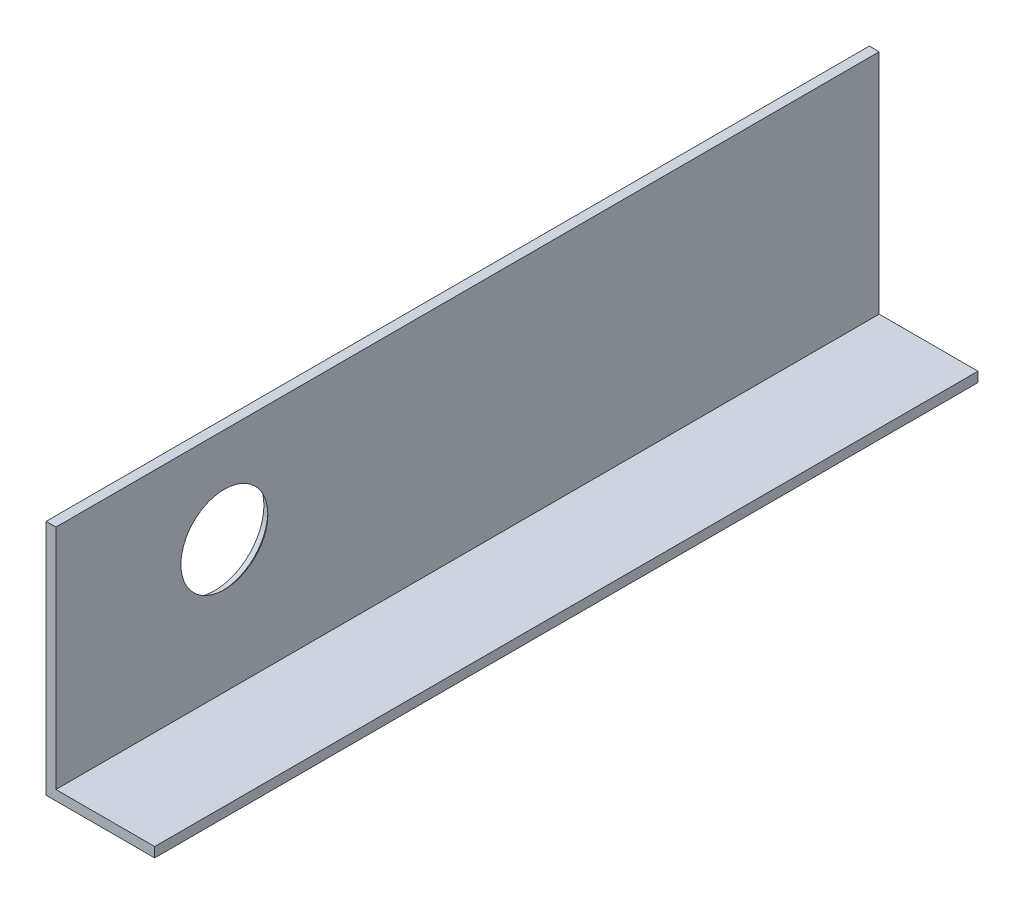
ISO-10303-21;
HEADER;
FILE_DESCRIPTION(('STEP AP214'),'2;1');
FILE_NAME('part.step','',(''),(''),'','','');
FILE_SCHEMA(('AUTOMOTIVE_DESIGN { 1 0 10303 214 1 1 1 1 }'));
ENDSEC;
DATA;
#1=APPLICATION_CONTEXT('core data for automotive mechanical design processes');
#2=APPLICATION_PROTOCOL_DEFINITION('international standard','automotive_design',2000,#1);
#3=PRODUCT_CONTEXT('',#1,'mechanical');
#4=PRODUCT('Part','Part','',(#3));
#5=PRODUCT_RELATED_PRODUCT_CATEGORY('part','',(#4));
#6=PRODUCT_DEFINITION_FORMATION('','',#4);
#7=PRODUCT_DEFINITION_CONTEXT('part definition',#1,'design');
#8=PRODUCT_DEFINITION('design','',#6,#7);
#9=PRODUCT_DEFINITION_SHAPE('','',#8);
#10=(LENGTH_UNIT() NAMED_UNIT(*) SI_UNIT(.MILLI.,.METRE.));
#11=(NAMED_UNIT(*) PLANE_ANGLE_UNIT() SI_UNIT($,.RADIAN.));
#12=(NAMED_UNIT(*) SI_UNIT($,.STERADIAN.) SOLID_ANGLE_UNIT());
#13=UNCERTAINTY_MEASURE_WITH_UNIT(LENGTH_MEASURE(1.E-05),#10,'distance_accuracy_value','');
#14=(GEOMETRIC_REPRESENTATION_CONTEXT(3) GLOBAL_UNCERTAINTY_ASSIGNED_CONTEXT((#13)) GLOBAL_UNIT_ASSIGNED_CONTEXT((#10,
#11,#12)) REPRESENTATION_CONTEXT('',''));
#15=CARTESIAN_POINT('',(0.,0.,0.));
#16=DIRECTION('',(0.,0.,1.));
#17=DIRECTION('',(1.,0.,0.));
#18=AXIS2_PLACEMENT_3D('',#15,#16,#17);
#19=CARTESIAN_POINT('',(0.,72.,250.));
#20=DIRECTION('',(0.,1.,0.));
#21=DIRECTION('',(0.,0.,1.));
#22=AXIS2_PLACEMENT_3D('',#19,#20,#21);
#23=PLANE('',#22);
#24=DIRECTION('',(1.,0.,0.));
#25=VECTOR('',#24,1.);
#26=CARTESIAN_POINT('',(0.,72.,0.));
#27=LINE('',#26,#25);
#28=CARTESIAN_POINT('',(0.,72.,0.));
#29=VERTEX_POINT('',#28);
#30=CARTESIAN_POINT('',(3.00000000000001,72.,0.));
#31=VERTEX_POINT('',#30);
#32=EDGE_CURVE('E124',#29,#31,#27,.T.);
#33=ORIENTED_EDGE('',*,*,#32,.F.);
#34=DIRECTION('',(0.,0.,-1.));
#35=VECTOR('',#34,1.);
#36=CARTESIAN_POINT('',(0.,72.,250.));
#37=LINE('',#36,#35);
#38=CARTESIAN_POINT('',(0.,72.,250.));
#39=VERTEX_POINT('',#38);
#40=EDGE_CURVE('E11',#39,#29,#37,.T.);
#41=ORIENTED_EDGE('',*,*,#40,.F.);
#42=DIRECTION('',(1.,0.,0.));
#43=VECTOR('',#42,1.);
#44=CARTESIAN_POINT('',(0.,72.,250.));
#45=LINE('',#44,#43);
#46=CARTESIAN_POINT('',(3.00000000000001,72.,250.));
#47=VERTEX_POINT('',#46);
#48=EDGE_CURVE('E135',#39,#47,#45,.T.);
#49=ORIENTED_EDGE('',*,*,#48,.T.);
#50=DIRECTION('',(0.,0.,-1.));
#51=VECTOR('',#50,1.);
#52=CARTESIAN_POINT('',(3.00000000000001,72.,250.));
#53=LINE('',#52,#51);
#54=EDGE_CURVE('E123',#47,#31,#53,.T.);
#55=ORIENTED_EDGE('',*,*,#54,.T.);
#56=EDGE_LOOP('',(#33,#41,#49,#55));
#57=FACE_BOUND('',#56,.T.);
#58=ADVANCED_FACE('F36',(#57),#23,.T.);
#59=CARTESIAN_POINT('',(0.,72.,250.));
#60=DIRECTION('',(1.,0.,0.));
#61=DIRECTION('',(0.,1.,0.));
#62=AXIS2_PLACEMENT_3D('',#59,#60,#61);
#63=PLANE('',#62);
#64=CARTESIAN_POINT('',(0.,43.1762021680064,198.837075549151));
#65=DIRECTION('',(1.,0.,0.));
#66=DIRECTION('',(0.,1.,0.));
#67=AXIS2_PLACEMENT_3D('',#64,#65,#66);
#68=CIRCLE('',#67,15.);
#69=CARTESIAN_POINT('',(0.,58.1762021680064,198.837075549151));
#70=VERTEX_POINT('',#69);
#71=EDGE_CURVE('E39',#70,#70,#68,.T.);
#72=ORIENTED_EDGE('',*,*,#71,.T.);
#73=EDGE_LOOP('',(#72));
#74=FACE_BOUND('',#73,.T.);
#75=DIRECTION('',(0.,-1.,0.));
#76=VECTOR('',#75,1.);
#77=CARTESIAN_POINT('',(0.,72.,0.));
#78=LINE('',#77,#76);
#79=CARTESIAN_POINT('',(0.,0.,0.));
#80=VERTEX_POINT('',#79);
#81=EDGE_CURVE('E76',#29,#80,#78,.T.);
#82=ORIENTED_EDGE('',*,*,#81,.T.);
#83=DIRECTION('',(0.,0.,-1.));
#84=VECTOR('',#83,1.);
#85=CARTESIAN_POINT('',(0.,0.,250.));
#86=LINE('',#85,#84);
#87=CARTESIAN_POINT('',(0.,0.,250.));
#88=VERTEX_POINT('',#87);
#89=EDGE_CURVE('E45',#88,#80,#86,.T.);
#90=ORIENTED_EDGE('',*,*,#89,.F.);
#91=DIRECTION('',(0.,-1.,0.));
#92=VECTOR('',#91,1.);
#93=CARTESIAN_POINT('',(0.,72.,250.));
#94=LINE('',#93,#92);
#95=EDGE_CURVE('E102',#39,#88,#94,.T.);
#96=ORIENTED_EDGE('',*,*,#95,.F.);
#97=ORIENTED_EDGE('',*,*,#40,.T.);
#98=EDGE_LOOP('',(#82,#90,#96,#97));
#99=FACE_BOUND('',#98,.T.);
#100=ADVANCED_FACE('F165',(#74,#99),#63,.F.);
#101=CARTESIAN_POINT('',(0.,0.,250.));
#102=DIRECTION('',(0.,1.,0.));
#103=DIRECTION('',(0.,0.,1.));
#104=AXIS2_PLACEMENT_3D('',#101,#102,#103);
#105=PLANE('',#104);
#106=DIRECTION('',(1.,0.,0.));
#107=VECTOR('',#106,1.);
#108=CARTESIAN_POINT('',(0.,0.,0.));
#109=LINE('',#108,#107);
#110=CARTESIAN_POINT('',(33.,0.,0.));
#111=VERTEX_POINT('',#110);
#112=EDGE_CURVE('E109',#80,#111,#109,.T.);
#113=ORIENTED_EDGE('',*,*,#112,.T.);
#114=DIRECTION('',(0.,0.,-1.));
#115=VECTOR('',#114,1.);
#116=CARTESIAN_POINT('',(33.,0.,250.));
#117=LINE('',#116,#115);
#118=CARTESIAN_POINT('',(33.,0.,250.));
#119=VERTEX_POINT('',#118);
#120=EDGE_CURVE('E106',#119,#111,#117,.T.);
#121=ORIENTED_EDGE('',*,*,#120,.F.);
#122=DIRECTION('',(1.,0.,0.));
#123=VECTOR('',#122,1.);
#124=CARTESIAN_POINT('',(0.,0.,250.));
#125=LINE('',#124,#123);
#126=EDGE_CURVE('E96',#88,#119,#125,.T.);
#127=ORIENTED_EDGE('',*,*,#126,.F.);
#128=ORIENTED_EDGE('',*,*,#89,.T.);
#129=EDGE_LOOP('',(#113,#121,#127,#128));
#130=FACE_BOUND('',#129,.T.);
#131=ADVANCED_FACE('F107',(#130),#105,.F.);
#132=CARTESIAN_POINT('',(33.,0.,250.));
#133=DIRECTION('',(-1.,0.,0.));
#134=DIRECTION('',(0.,0.,1.));
#135=AXIS2_PLACEMENT_3D('',#132,#133,#134);
#136=PLANE('',#135);
#137=DIRECTION('',(0.,1.,0.));
#138=VECTOR('',#137,1.);
#139=CARTESIAN_POINT('',(33.,0.,0.));
#140=LINE('',#139,#138);
#141=CARTESIAN_POINT('',(33.,3.,0.));
#142=VERTEX_POINT('',#141);
#143=EDGE_CURVE('E132',#111,#142,#140,.T.);
#144=ORIENTED_EDGE('',*,*,#143,.T.);
#145=DIRECTION('',(0.,0.,-1.));
#146=VECTOR('',#145,1.);
#147=CARTESIAN_POINT('',(33.,3.,250.));
#148=LINE('',#147,#146);
#149=CARTESIAN_POINT('',(33.,3.,250.));
#150=VERTEX_POINT('',#149);
#151=EDGE_CURVE('E112',#150,#142,#148,.T.);
#152=ORIENTED_EDGE('',*,*,#151,.F.);
#153=DIRECTION('',(0.,1.,0.));
#154=VECTOR('',#153,1.);
#155=CARTESIAN_POINT('',(33.,0.,250.));
#156=LINE('',#155,#154);
#157=EDGE_CURVE('E100',#119,#150,#156,.T.);
#158=ORIENTED_EDGE('',*,*,#157,.F.);
#159=ORIENTED_EDGE('',*,*,#120,.T.);
#160=EDGE_LOOP('',(#144,#152,#158,#159));
#161=FACE_BOUND('',#160,.T.);
#162=ADVANCED_FACE('F114',(#161),#136,.F.);
#163=CARTESIAN_POINT('',(33.,3.,250.));
#164=DIRECTION('',(0.,-1.,0.));
#165=DIRECTION('',(1.,0.,0.));
#166=AXIS2_PLACEMENT_3D('',#163,#164,#165);
#167=PLANE('',#166);
#168=DIRECTION('',(-1.,0.,0.));
#169=VECTOR('',#168,1.);
#170=CARTESIAN_POINT('',(33.,3.,0.));
#171=LINE('',#170,#169);
#172=CARTESIAN_POINT('',(3.00000000000001,3.,0.));
#173=VERTEX_POINT('',#172);
#174=EDGE_CURVE('E130',#142,#173,#171,.T.);
#175=ORIENTED_EDGE('',*,*,#174,.T.);
#176=DIRECTION('',(0.,0.,-1.));
#177=VECTOR('',#176,1.);
#178=CARTESIAN_POINT('',(3.00000000000001,3.,250.));
#179=LINE('',#178,#177);
#180=CARTESIAN_POINT('',(3.00000000000001,3.,250.));
#181=VERTEX_POINT('',#180);
#182=EDGE_CURVE('E139',#181,#173,#179,.T.);
#183=ORIENTED_EDGE('',*,*,#182,.F.);
#184=DIRECTION('',(-1.,0.,0.));
#185=VECTOR('',#184,1.);
#186=CARTESIAN_POINT('',(33.,3.,250.));
#187=LINE('',#186,#185);
#188=EDGE_CURVE('E117',#150,#181,#187,.T.);
#189=ORIENTED_EDGE('',*,*,#188,.F.);
#190=ORIENTED_EDGE('',*,*,#151,.T.);
#191=EDGE_LOOP('',(#175,#183,#189,#190));
#192=FACE_BOUND('',#191,.T.);
#193=ADVANCED_FACE('F149',(#192),#167,.F.);
#194=CARTESIAN_POINT('',(3.00000000000001,3.,250.));
#195=DIRECTION('',(-1.,0.,0.));
#196=DIRECTION('',(0.,-1.,0.));
#197=AXIS2_PLACEMENT_3D('',#194,#195,#196);
#198=PLANE('',#197);
#199=CARTESIAN_POINT('',(2.99999999997866,43.1762021680064,198.837075549151));
#200=DIRECTION('',(1.,0.,0.));
#201=DIRECTION('',(0.,-0.168711059845982,-0.98566555092772));
#202=AXIS2_PLACEMENT_3D('',#199,#200,#201);
#203=CIRCLE('',#202,13.2);
#204=CARTESIAN_POINT('',(2.99999999997866,40.9492161780395,185.826290276905));
#205=VERTEX_POINT('',#204);
#206=EDGE_CURVE('E152',#205,#205,#203,.T.);
#207=ORIENTED_EDGE('',*,*,#206,.F.);
#208=EDGE_LOOP('',(#207));
#209=FACE_BOUND('',#208,.T.);
#210=DIRECTION('',(0.,1.,0.));
#211=VECTOR('',#210,1.);
#212=CARTESIAN_POINT('',(3.00000000000001,3.,0.));
#213=LINE('',#212,#211);
#214=EDGE_CURVE('E127',#173,#31,#213,.T.);
#215=ORIENTED_EDGE('',*,*,#214,.T.);
#216=ORIENTED_EDGE('',*,*,#54,.F.);
#217=DIRECTION('',(0.,1.,0.));
#218=VECTOR('',#217,1.);
#219=CARTESIAN_POINT('',(3.00000000000001,3.,250.));
#220=LINE('',#219,#218);
#221=EDGE_CURVE('E86',#181,#47,#220,.T.);
#222=ORIENTED_EDGE('',*,*,#221,.F.);
#223=ORIENTED_EDGE('',*,*,#182,.T.);
#224=EDGE_LOOP('',(#215,#216,#222,#223));
#225=FACE_BOUND('',#224,.T.);
#226=ADVANCED_FACE('F143',(#209,#225),#198,.F.);
#227=CARTESIAN_POINT('',(0.,0.,250.));
#228=DIRECTION('',(0.,0.,1.));
#229=DIRECTION('',(1.,0.,0.));
#230=AXIS2_PLACEMENT_3D('',#227,#228,#229);
#231=PLANE('',#230);
#232=ORIENTED_EDGE('',*,*,#48,.F.);
#233=ORIENTED_EDGE('',*,*,#95,.T.);
#234=ORIENTED_EDGE('',*,*,#126,.T.);
#235=ORIENTED_EDGE('',*,*,#157,.T.);
#236=ORIENTED_EDGE('',*,*,#188,.T.);
#237=ORIENTED_EDGE('',*,*,#221,.T.);
#238=EDGE_LOOP('',(#232,#233,#234,#235,#236,#237));
#239=FACE_BOUND('',#238,.T.);
#240=ADVANCED_FACE('F98',(#239),#231,.T.);
#241=CARTESIAN_POINT('',(0.,0.,0.));
#242=DIRECTION('',(0.,0.,1.));
#243=DIRECTION('',(1.,0.,0.));
#244=AXIS2_PLACEMENT_3D('',#241,#242,#243);
#245=PLANE('',#244);
#246=ORIENTED_EDGE('',*,*,#32,.T.);
#247=ORIENTED_EDGE('',*,*,#214,.F.);
#248=ORIENTED_EDGE('',*,*,#174,.F.);
#249=ORIENTED_EDGE('',*,*,#143,.F.);
#250=ORIENTED_EDGE('',*,*,#112,.F.);
#251=ORIENTED_EDGE('',*,*,#81,.F.);
#252=EDGE_LOOP('',(#246,#247,#248,#249,#250,#251));
#253=FACE_BOUND('',#252,.T.);
#254=ADVANCED_FACE('F147',(#253),#245,.F.);
#255=CARTESIAN_POINT('',(5.79999999997866,43.1762021680064,198.837075549151));
#256=DIRECTION('',(-1.,0.,0.));
#257=DIRECTION('',(0.,-0.168711059845982,-0.98566555092772));
#258=AXIS2_PLACEMENT_3D('',#255,#256,#257);
#259=CYLINDRICAL_SURFACE('',#258,15.);
#260=CARTESIAN_POINT('',(2.19999999997866,43.1762021680064,198.837075549151));
#261=DIRECTION('',(1.,0.,0.));
#262=DIRECTION('',(0.,-0.168711059845982,-0.98566555092772));
#263=AXIS2_PLACEMENT_3D('',#260,#261,#262);
#264=CIRCLE('',#263,15.);
#265=CARTESIAN_POINT('',(2.19999999997866,45.7068680656962,213.622058813067));
#266=VERTEX_POINT('',#265);
#267=EDGE_CURVE('E158',#266,#266,#264,.T.);
#268=ORIENTED_EDGE('',*,*,#267,.T.);
#269=EDGE_LOOP('',(#268));
#270=FACE_BOUND('',#269,.T.);
#271=ORIENTED_EDGE('',*,*,#71,.F.);
#272=EDGE_LOOP('',(#271));
#273=FACE_BOUND('',#272,.T.);
#274=ADVANCED_FACE('F167',(#270,#273),#259,.F.);
#275=CARTESIAN_POINT('',(2.19999999997866,43.1762021680064,198.837075549151));
#276=DIRECTION('',(-1.,0.,0.));
#277=DIRECTION('',(0.,-0.168711059845982,-0.98566555092772));
#278=AXIS2_PLACEMENT_3D('',#275,#276,#277);
#279=PLANE('',#278);
#280=ORIENTED_EDGE('',*,*,#267,.F.);
#281=EDGE_LOOP('',(#280));
#282=FACE_BOUND('',#281,.T.);
#283=CARTESIAN_POINT('',(2.19999999997866,43.1762021680064,198.837075549151));
#284=DIRECTION('',(1.,0.,0.));
#285=DIRECTION('',(0.,-0.168711059845982,-0.98566555092772));
#286=AXIS2_PLACEMENT_3D('',#283,#284,#285);
#287=CIRCLE('',#286,14.);
#288=CARTESIAN_POINT('',(2.19999999997866,40.8142473301627,185.037757836163));
#289=VERTEX_POINT('',#288);
#290=EDGE_CURVE('E155',#289,#289,#287,.T.);
#291=ORIENTED_EDGE('',*,*,#290,.T.);
#292=EDGE_LOOP('',(#291));
#293=FACE_BOUND('',#292,.T.);
#294=ADVANCED_FACE('F169',(#282,#293),#279,.T.);
#295=CARTESIAN_POINT('',(2.19999999997866,43.1762021680064,198.837075549151));
#296=DIRECTION('',(1.,0.,0.));
#297=DIRECTION('',(0.,-0.17782537654371,-0.984062058742785));
#298=AXIS2_PLACEMENT_3D('',#295,#296,#297);
#299=TOROIDAL_SURFACE('',#298,13.2,0.8);
#300=ORIENTED_EDGE('',*,*,#206,.T.);
#301=EDGE_LOOP('',(#300));
#302=FACE_BOUND('',#301,.T.);
#303=ORIENTED_EDGE('',*,*,#290,.F.);
#304=EDGE_LOOP('',(#303));
#305=FACE_BOUND('',#304,.T.);
#306=ADVANCED_FACE('F175',(#302,#305),#299,.F.);
#307=CLOSED_SHELL('',(#58,#100,#131,#162,#193,#226,#240,#254,#274,#294,#306));
#308=MANIFOLD_SOLID_BREP('B2',#307);
#309=ADVANCED_BREP_SHAPE_REPRESENTATION('',(#18,#308),#14);
#310=SHAPE_DEFINITION_REPRESENTATION(#9,#309);
ENDSEC;
END-ISO-10303-21;
